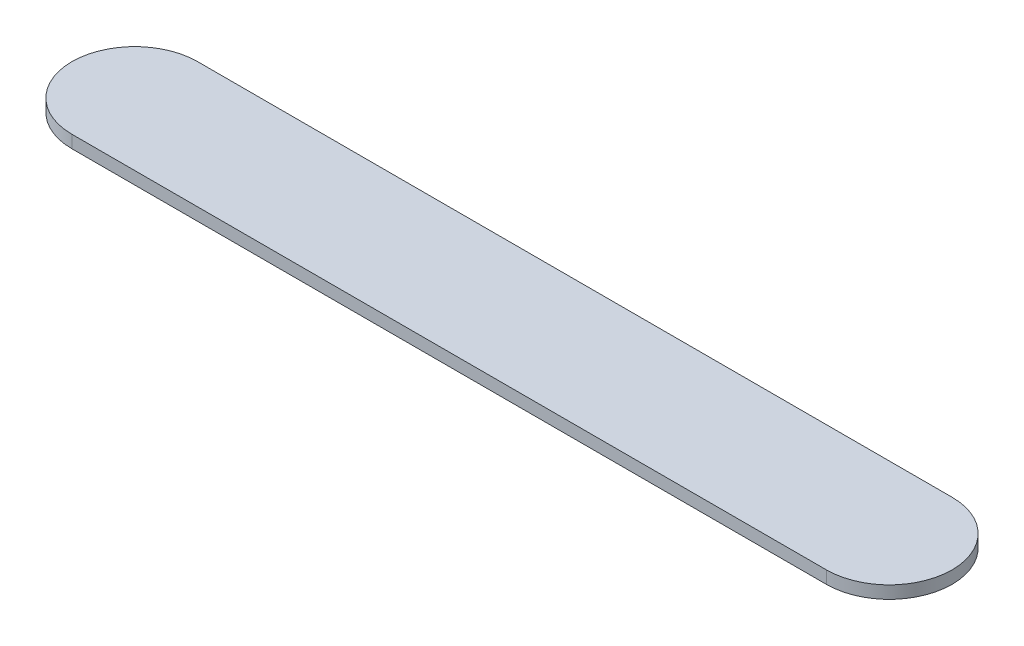
ISO-10303-21;
HEADER;
FILE_DESCRIPTION(('STEP AP214'),'2;1');
FILE_NAME('part.step','',(''),(''),'','','');
FILE_SCHEMA(('AUTOMOTIVE_DESIGN { 1 0 10303 214 1 1 1 1 }'));
ENDSEC;
DATA;
#1=APPLICATION_CONTEXT('core data for automotive mechanical design processes');
#2=APPLICATION_PROTOCOL_DEFINITION('international standard','automotive_design',2000,#1);
#3=PRODUCT_CONTEXT('',#1,'mechanical');
#4=PRODUCT('Part','Part','',(#3));
#5=PRODUCT_RELATED_PRODUCT_CATEGORY('part','',(#4));
#6=PRODUCT_DEFINITION_FORMATION('','',#4);
#7=PRODUCT_DEFINITION_CONTEXT('part definition',#1,'design');
#8=PRODUCT_DEFINITION('design','',#6,#7);
#9=PRODUCT_DEFINITION_SHAPE('','',#8);
#10=(LENGTH_UNIT() NAMED_UNIT(*) SI_UNIT(.MILLI.,.METRE.));
#11=(NAMED_UNIT(*) PLANE_ANGLE_UNIT() SI_UNIT($,.RADIAN.));
#12=(NAMED_UNIT(*) SI_UNIT($,.STERADIAN.) SOLID_ANGLE_UNIT());
#13=UNCERTAINTY_MEASURE_WITH_UNIT(LENGTH_MEASURE(1.E-05),#10,'distance_accuracy_value','');
#14=(GEOMETRIC_REPRESENTATION_CONTEXT(3) GLOBAL_UNCERTAINTY_ASSIGNED_CONTEXT((#13)) GLOBAL_UNIT_ASSIGNED_CONTEXT((#10,
#11,#12)) REPRESENTATION_CONTEXT('',''));
#15=CARTESIAN_POINT('',(0.,0.,0.));
#16=DIRECTION('',(0.,0.,1.));
#17=DIRECTION('',(1.,0.,0.));
#18=AXIS2_PLACEMENT_3D('',#15,#16,#17);
#19=CARTESIAN_POINT('',(-47.625,1.58750000000002,0.));
#20=DIRECTION('',(0.,-1.,0.));
#21=DIRECTION('',(0.,0.,-1.));
#22=AXIS2_PLACEMENT_3D('',#19,#20,#21);
#23=CYLINDRICAL_SURFACE('',#22,7.9375);
#24=CARTESIAN_POINT('',(-47.625,0.,0.));
#25=DIRECTION('',(0.,1.,0.));
#26=DIRECTION('',(0.,0.,1.));
#27=AXIS2_PLACEMENT_3D('',#24,#25,#26);
#28=CIRCLE('',#27,7.9375);
#29=CARTESIAN_POINT('',(-47.625,0.,-7.93750000000001));
#30=VERTEX_POINT('',#29);
#31=CARTESIAN_POINT('',(-47.625,0.,7.93750000000001));
#32=VERTEX_POINT('',#31);
#33=EDGE_CURVE('E95',#30,#32,#28,.T.);
#34=ORIENTED_EDGE('',*,*,#33,.T.);
#35=DIRECTION('',(0.,-1.,0.));
#36=VECTOR('',#35,1.);
#37=CARTESIAN_POINT('',(-47.625,1.58750000000002,7.93750000000001));
#38=LINE('',#37,#36);
#39=CARTESIAN_POINT('',(-47.625,1.58750000000002,7.93750000000001));
#40=VERTEX_POINT('',#39);
#41=EDGE_CURVE('E11',#40,#32,#38,.T.);
#42=ORIENTED_EDGE('',*,*,#41,.F.);
#43=CARTESIAN_POINT('',(-47.625,1.58750000000002,0.));
#44=DIRECTION('',(0.,1.,0.));
#45=DIRECTION('',(0.,0.,1.));
#46=AXIS2_PLACEMENT_3D('',#43,#44,#45);
#47=CIRCLE('',#46,7.9375);
#48=CARTESIAN_POINT('',(-47.625,1.58750000000002,-7.93750000000001));
#49=VERTEX_POINT('',#48);
#50=EDGE_CURVE('E83',#49,#40,#47,.T.);
#51=ORIENTED_EDGE('',*,*,#50,.F.);
#52=DIRECTION('',(0.,-1.,0.));
#53=VECTOR('',#52,1.);
#54=CARTESIAN_POINT('',(-47.625,1.58750000000002,-7.93750000000001));
#55=LINE('',#54,#53);
#56=EDGE_CURVE('E91',#49,#30,#55,.T.);
#57=ORIENTED_EDGE('',*,*,#56,.T.);
#58=EDGE_LOOP('',(#34,#42,#51,#57));
#59=FACE_BOUND('',#58,.T.);
#60=ADVANCED_FACE('F32',(#59),#23,.T.);
#61=CARTESIAN_POINT('',(-47.625,1.58750000000002,7.93750000000001));
#62=DIRECTION('',(0.,0.,-1.));
#63=DIRECTION('',(-1.,0.,0.));
#64=AXIS2_PLACEMENT_3D('',#61,#62,#63);
#65=PLANE('',#64);
#66=DIRECTION('',(1.,0.,0.));
#67=VECTOR('',#66,1.);
#68=CARTESIAN_POINT('',(-47.625,0.,7.93750000000001));
#69=LINE('',#68,#67);
#70=CARTESIAN_POINT('',(47.625,0.,7.93750000000001));
#71=VERTEX_POINT('',#70);
#72=EDGE_CURVE('E87',#32,#71,#69,.T.);
#73=ORIENTED_EDGE('',*,*,#72,.T.);
#74=DIRECTION('',(0.,-1.,0.));
#75=VECTOR('',#74,1.);
#76=CARTESIAN_POINT('',(47.625,1.58750000000002,7.93750000000001));
#77=LINE('',#76,#75);
#78=CARTESIAN_POINT('',(47.625,1.58750000000002,7.93750000000001));
#79=VERTEX_POINT('',#78);
#80=EDGE_CURVE('E40',#79,#71,#77,.T.);
#81=ORIENTED_EDGE('',*,*,#80,.F.);
#82=DIRECTION('',(1.,0.,0.));
#83=VECTOR('',#82,1.);
#84=CARTESIAN_POINT('',(-47.625,1.58750000000002,7.93750000000001));
#85=LINE('',#84,#83);
#86=EDGE_CURVE('E78',#40,#79,#85,.T.);
#87=ORIENTED_EDGE('',*,*,#86,.F.);
#88=ORIENTED_EDGE('',*,*,#41,.T.);
#89=EDGE_LOOP('',(#73,#81,#87,#88));
#90=FACE_BOUND('',#89,.T.);
#91=ADVANCED_FACE('F86',(#90),#65,.F.);
#92=CARTESIAN_POINT('',(47.625,1.58750000000002,0.));
#93=DIRECTION('',(0.,-1.,0.));
#94=DIRECTION('',(0.,0.,-1.));
#95=AXIS2_PLACEMENT_3D('',#92,#93,#94);
#96=CYLINDRICAL_SURFACE('',#95,7.9375);
#97=CARTESIAN_POINT('',(47.625,0.,0.));
#98=DIRECTION('',(0.,1.,0.));
#99=DIRECTION('',(0.,0.,1.));
#100=AXIS2_PLACEMENT_3D('',#97,#98,#99);
#101=CIRCLE('',#100,7.9375);
#102=CARTESIAN_POINT('',(47.625,0.,-7.93750000000001));
#103=VERTEX_POINT('',#102);
#104=EDGE_CURVE('E65',#71,#103,#101,.T.);
#105=ORIENTED_EDGE('',*,*,#104,.T.);
#106=DIRECTION('',(0.,-1.,0.));
#107=VECTOR('',#106,1.);
#108=CARTESIAN_POINT('',(47.625,1.58750000000002,-7.93750000000001));
#109=LINE('',#108,#107);
#110=CARTESIAN_POINT('',(47.625,1.58750000000002,-7.93750000000001));
#111=VERTEX_POINT('',#110);
#112=EDGE_CURVE('E88',#111,#103,#109,.T.);
#113=ORIENTED_EDGE('',*,*,#112,.F.);
#114=CARTESIAN_POINT('',(47.625,1.58750000000002,0.));
#115=DIRECTION('',(0.,1.,0.));
#116=DIRECTION('',(0.,0.,1.));
#117=AXIS2_PLACEMENT_3D('',#114,#115,#116);
#118=CIRCLE('',#117,7.9375);
#119=EDGE_CURVE('E81',#79,#111,#118,.T.);
#120=ORIENTED_EDGE('',*,*,#119,.F.);
#121=ORIENTED_EDGE('',*,*,#80,.T.);
#122=EDGE_LOOP('',(#105,#113,#120,#121));
#123=FACE_BOUND('',#122,.T.);
#124=ADVANCED_FACE('F89',(#123),#96,.T.);
#125=CARTESIAN_POINT('',(-47.625,1.58750000000002,-7.93750000000001));
#126=DIRECTION('',(0.,0.,1.));
#127=DIRECTION('',(1.,0.,0.));
#128=AXIS2_PLACEMENT_3D('',#125,#126,#127);
#129=PLANE('',#128);
#130=DIRECTION('',(-1.,0.,0.));
#131=VECTOR('',#130,1.);
#132=CARTESIAN_POINT('',(-47.625,0.,-7.93750000000001));
#133=LINE('',#132,#131);
#134=EDGE_CURVE('E71',#103,#30,#133,.T.);
#135=ORIENTED_EDGE('',*,*,#134,.T.);
#136=ORIENTED_EDGE('',*,*,#56,.F.);
#137=DIRECTION('',(-1.,0.,0.));
#138=VECTOR('',#137,1.);
#139=CARTESIAN_POINT('',(-47.625,1.58750000000002,-7.93750000000001));
#140=LINE('',#139,#138);
#141=EDGE_CURVE('E48',#111,#49,#140,.T.);
#142=ORIENTED_EDGE('',*,*,#141,.F.);
#143=ORIENTED_EDGE('',*,*,#112,.T.);
#144=EDGE_LOOP('',(#135,#136,#142,#143));
#145=FACE_BOUND('',#144,.T.);
#146=ADVANCED_FACE('F102',(#145),#129,.F.);
#147=CARTESIAN_POINT('',(-47.625,1.58750000000002,0.));
#148=DIRECTION('',(0.,1.,0.));
#149=DIRECTION('',(0.,0.,1.));
#150=AXIS2_PLACEMENT_3D('',#147,#148,#149);
#151=PLANE('',#150);
#152=ORIENTED_EDGE('',*,*,#50,.T.);
#153=ORIENTED_EDGE('',*,*,#86,.T.);
#154=ORIENTED_EDGE('',*,*,#119,.T.);
#155=ORIENTED_EDGE('',*,*,#141,.T.);
#156=EDGE_LOOP('',(#152,#153,#154,#155));
#157=FACE_BOUND('',#156,.T.);
#158=ADVANCED_FACE('F79',(#157),#151,.T.);
#159=CARTESIAN_POINT('',(-47.625,0.,0.));
#160=DIRECTION('',(0.,1.,0.));
#161=DIRECTION('',(0.,0.,1.));
#162=AXIS2_PLACEMENT_3D('',#159,#160,#161);
#163=PLANE('',#162);
#164=ORIENTED_EDGE('',*,*,#33,.F.);
#165=ORIENTED_EDGE('',*,*,#134,.F.);
#166=ORIENTED_EDGE('',*,*,#104,.F.);
#167=ORIENTED_EDGE('',*,*,#72,.F.);
#168=EDGE_LOOP('',(#164,#165,#166,#167));
#169=FACE_BOUND('',#168,.T.);
#170=ADVANCED_FACE('F105',(#169),#163,.F.);
#171=CLOSED_SHELL('',(#60,#91,#124,#146,#158,#170));
#172=MANIFOLD_SOLID_BREP('B2',#171);
#173=ADVANCED_BREP_SHAPE_REPRESENTATION('',(#18,#172),#14);
#174=SHAPE_DEFINITION_REPRESENTATION(#9,#173);
ENDSEC;
END-ISO-10303-21;
